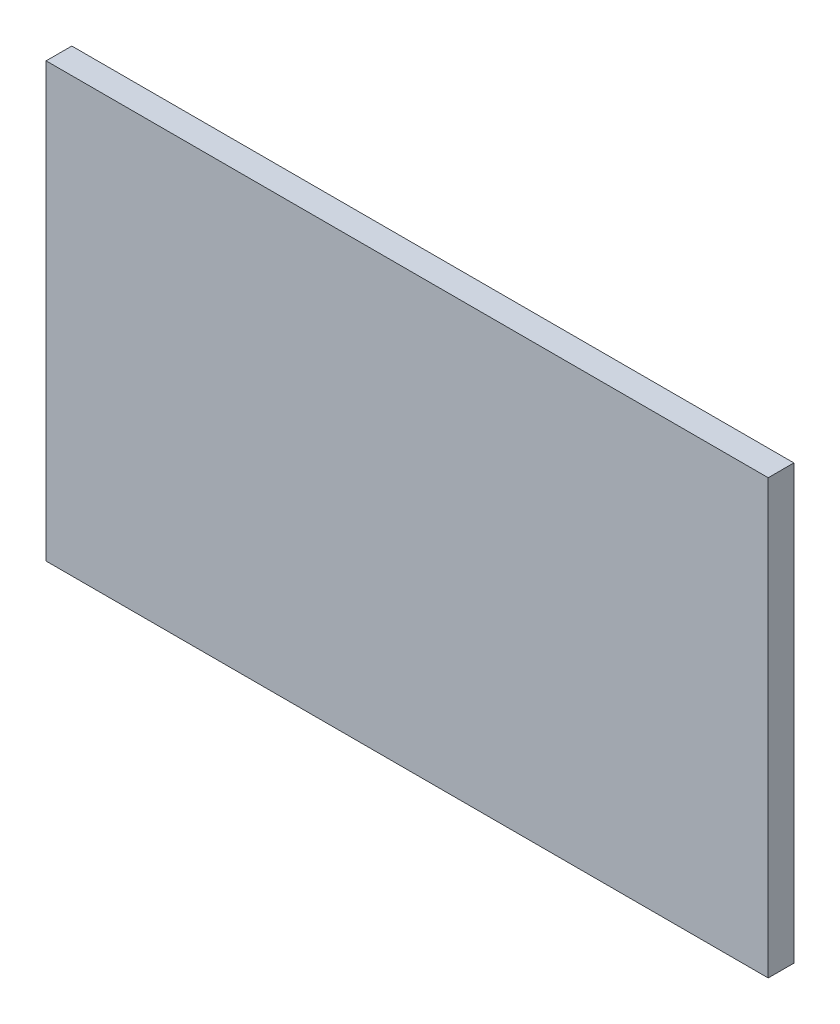
ISO-10303-21;
HEADER;
FILE_DESCRIPTION(('STEP AP214'),'2;1');
FILE_NAME('part.step','',(''),(''),'','','');
FILE_SCHEMA(('AUTOMOTIVE_DESIGN { 1 0 10303 214 1 1 1 1 }'));
ENDSEC;
DATA;
#1=APPLICATION_CONTEXT('core data for automotive mechanical design processes');
#2=APPLICATION_PROTOCOL_DEFINITION('international standard','automotive_design',2000,#1);
#3=PRODUCT_CONTEXT('',#1,'mechanical');
#4=PRODUCT('Part','Part','',(#3));
#5=PRODUCT_RELATED_PRODUCT_CATEGORY('part','',(#4));
#6=PRODUCT_DEFINITION_FORMATION('','',#4);
#7=PRODUCT_DEFINITION_CONTEXT('part definition',#1,'design');
#8=PRODUCT_DEFINITION('design','',#6,#7);
#9=PRODUCT_DEFINITION_SHAPE('','',#8);
#10=(LENGTH_UNIT() NAMED_UNIT(*) SI_UNIT(.MILLI.,.METRE.));
#11=(NAMED_UNIT(*) PLANE_ANGLE_UNIT() SI_UNIT($,.RADIAN.));
#12=(NAMED_UNIT(*) SI_UNIT($,.STERADIAN.) SOLID_ANGLE_UNIT());
#13=UNCERTAINTY_MEASURE_WITH_UNIT(LENGTH_MEASURE(1.E-05),#10,'distance_accuracy_value','');
#14=(GEOMETRIC_REPRESENTATION_CONTEXT(3) GLOBAL_UNCERTAINTY_ASSIGNED_CONTEXT((#13)) GLOBAL_UNIT_ASSIGNED_CONTEXT((#10,
#11,#12)) REPRESENTATION_CONTEXT('',''));
#15=CARTESIAN_POINT('',(0.,0.,0.));
#16=DIRECTION('',(0.,0.,1.));
#17=DIRECTION('',(1.,0.,0.));
#18=AXIS2_PLACEMENT_3D('',#15,#16,#17);
#19=CARTESIAN_POINT('',(-225.,-135.,16.));
#20=DIRECTION('',(1.,0.,0.));
#21=DIRECTION('',(0.,0.,-1.));
#22=AXIS2_PLACEMENT_3D('',#19,#20,#21);
#23=PLANE('',#22);
#24=DIRECTION('',(0.,-1.,0.));
#25=VECTOR('',#24,1.);
#26=CARTESIAN_POINT('',(-225.,-135.,0.));
#27=LINE('',#26,#25);
#28=CARTESIAN_POINT('',(-225.,135.,0.));
#29=VERTEX_POINT('',#28);
#30=CARTESIAN_POINT('',(-225.,-135.,0.));
#31=VERTEX_POINT('',#30);
#32=EDGE_CURVE('E98',#29,#31,#27,.T.);
#33=ORIENTED_EDGE('',*,*,#32,.T.);
#34=DIRECTION('',(0.,0.,-1.));
#35=VECTOR('',#34,1.);
#36=CARTESIAN_POINT('',(-225.,-135.,16.));
#37=LINE('',#36,#35);
#38=CARTESIAN_POINT('',(-225.,-135.,16.));
#39=VERTEX_POINT('',#38);
#40=EDGE_CURVE('E11',#39,#31,#37,.T.);
#41=ORIENTED_EDGE('',*,*,#40,.F.);
#42=DIRECTION('',(0.,-1.,0.));
#43=VECTOR('',#42,1.);
#44=CARTESIAN_POINT('',(-225.,-135.,16.));
#45=LINE('',#44,#43);
#46=CARTESIAN_POINT('',(-225.,135.,16.));
#47=VERTEX_POINT('',#46);
#48=EDGE_CURVE('E86',#47,#39,#45,.T.);
#49=ORIENTED_EDGE('',*,*,#48,.F.);
#50=DIRECTION('',(0.,0.,-1.));
#51=VECTOR('',#50,1.);
#52=CARTESIAN_POINT('',(-225.,135.,16.));
#53=LINE('',#52,#51);
#54=EDGE_CURVE('E94',#47,#29,#53,.T.);
#55=ORIENTED_EDGE('',*,*,#54,.T.);
#56=EDGE_LOOP('',(#33,#41,#49,#55));
#57=FACE_BOUND('',#56,.T.);
#58=ADVANCED_FACE('F35',(#57),#23,.F.);
#59=CARTESIAN_POINT('',(225.,-135.,16.));
#60=DIRECTION('',(0.,1.,0.));
#61=DIRECTION('',(-1.,0.,0.));
#62=AXIS2_PLACEMENT_3D('',#59,#60,#61);
#63=PLANE('',#62);
#64=DIRECTION('',(1.,0.,0.));
#65=VECTOR('',#64,1.);
#66=CARTESIAN_POINT('',(225.,-135.,0.));
#67=LINE('',#66,#65);
#68=CARTESIAN_POINT('',(225.,-135.,0.));
#69=VERTEX_POINT('',#68);
#70=EDGE_CURVE('E90',#31,#69,#67,.T.);
#71=ORIENTED_EDGE('',*,*,#70,.T.);
#72=DIRECTION('',(0.,0.,-1.));
#73=VECTOR('',#72,1.);
#74=CARTESIAN_POINT('',(225.,-135.,16.));
#75=LINE('',#74,#73);
#76=CARTESIAN_POINT('',(225.,-135.,16.));
#77=VERTEX_POINT('',#76);
#78=EDGE_CURVE('E43',#77,#69,#75,.T.);
#79=ORIENTED_EDGE('',*,*,#78,.F.);
#80=DIRECTION('',(1.,0.,0.));
#81=VECTOR('',#80,1.);
#82=CARTESIAN_POINT('',(225.,-135.,16.));
#83=LINE('',#82,#81);
#84=EDGE_CURVE('E81',#39,#77,#83,.T.);
#85=ORIENTED_EDGE('',*,*,#84,.F.);
#86=ORIENTED_EDGE('',*,*,#40,.T.);
#87=EDGE_LOOP('',(#71,#79,#85,#86));
#88=FACE_BOUND('',#87,.T.);
#89=ADVANCED_FACE('F89',(#88),#63,.F.);
#90=CARTESIAN_POINT('',(225.,-135.,16.));
#91=DIRECTION('',(-1.,0.,0.));
#92=DIRECTION('',(0.,0.,1.));
#93=AXIS2_PLACEMENT_3D('',#90,#91,#92);
#94=PLANE('',#93);
#95=DIRECTION('',(0.,1.,0.));
#96=VECTOR('',#95,1.);
#97=CARTESIAN_POINT('',(225.,-135.,0.));
#98=LINE('',#97,#96);
#99=CARTESIAN_POINT('',(225.,135.,0.));
#100=VERTEX_POINT('',#99);
#101=EDGE_CURVE('E68',#69,#100,#98,.T.);
#102=ORIENTED_EDGE('',*,*,#101,.T.);
#103=DIRECTION('',(0.,0.,-1.));
#104=VECTOR('',#103,1.);
#105=CARTESIAN_POINT('',(225.,135.,16.));
#106=LINE('',#105,#104);
#107=CARTESIAN_POINT('',(225.,135.,16.));
#108=VERTEX_POINT('',#107);
#109=EDGE_CURVE('E91',#108,#100,#106,.T.);
#110=ORIENTED_EDGE('',*,*,#109,.F.);
#111=DIRECTION('',(0.,1.,0.));
#112=VECTOR('',#111,1.);
#113=CARTESIAN_POINT('',(225.,-135.,16.));
#114=LINE('',#113,#112);
#115=EDGE_CURVE('E84',#77,#108,#114,.T.);
#116=ORIENTED_EDGE('',*,*,#115,.F.);
#117=ORIENTED_EDGE('',*,*,#78,.T.);
#118=EDGE_LOOP('',(#102,#110,#116,#117));
#119=FACE_BOUND('',#118,.T.);
#120=ADVANCED_FACE('F92',(#119),#94,.F.);
#121=CARTESIAN_POINT('',(225.,135.,16.));
#122=DIRECTION('',(0.,-1.,0.));
#123=DIRECTION('',(1.,0.,0.));
#124=AXIS2_PLACEMENT_3D('',#121,#122,#123);
#125=PLANE('',#124);
#126=DIRECTION('',(-1.,0.,0.));
#127=VECTOR('',#126,1.);
#128=CARTESIAN_POINT('',(225.,135.,0.));
#129=LINE('',#128,#127);
#130=EDGE_CURVE('E74',#100,#29,#129,.T.);
#131=ORIENTED_EDGE('',*,*,#130,.T.);
#132=ORIENTED_EDGE('',*,*,#54,.F.);
#133=DIRECTION('',(-1.,0.,0.));
#134=VECTOR('',#133,1.);
#135=CARTESIAN_POINT('',(225.,135.,16.));
#136=LINE('',#135,#134);
#137=EDGE_CURVE('E51',#108,#47,#136,.T.);
#138=ORIENTED_EDGE('',*,*,#137,.F.);
#139=ORIENTED_EDGE('',*,*,#109,.T.);
#140=EDGE_LOOP('',(#131,#132,#138,#139));
#141=FACE_BOUND('',#140,.T.);
#142=ADVANCED_FACE('F105',(#141),#125,.F.);
#143=CARTESIAN_POINT('',(0.,0.,16.));
#144=DIRECTION('',(0.,0.,1.));
#145=DIRECTION('',(1.,0.,0.));
#146=AXIS2_PLACEMENT_3D('',#143,#144,#145);
#147=PLANE('',#146);
#148=ORIENTED_EDGE('',*,*,#48,.T.);
#149=ORIENTED_EDGE('',*,*,#84,.T.);
#150=ORIENTED_EDGE('',*,*,#115,.T.);
#151=ORIENTED_EDGE('',*,*,#137,.T.);
#152=EDGE_LOOP('',(#148,#149,#150,#151));
#153=FACE_BOUND('',#152,.T.);
#154=ADVANCED_FACE('F82',(#153),#147,.T.);
#155=CARTESIAN_POINT('',(0.,0.,0.));
#156=DIRECTION('',(0.,0.,1.));
#157=DIRECTION('',(1.,0.,0.));
#158=AXIS2_PLACEMENT_3D('',#155,#156,#157);
#159=PLANE('',#158);
#160=ORIENTED_EDGE('',*,*,#32,.F.);
#161=ORIENTED_EDGE('',*,*,#130,.F.);
#162=ORIENTED_EDGE('',*,*,#101,.F.);
#163=ORIENTED_EDGE('',*,*,#70,.F.);
#164=EDGE_LOOP('',(#160,#161,#162,#163));
#165=FACE_BOUND('',#164,.T.);
#166=ADVANCED_FACE('F108',(#165),#159,.F.);
#167=CLOSED_SHELL('',(#58,#89,#120,#142,#154,#166));
#168=MANIFOLD_SOLID_BREP('B2',#167);
#169=ADVANCED_BREP_SHAPE_REPRESENTATION('',(#18,#168),#14);
#170=SHAPE_DEFINITION_REPRESENTATION(#9,#169);
ENDSEC;
END-ISO-10303-21;
